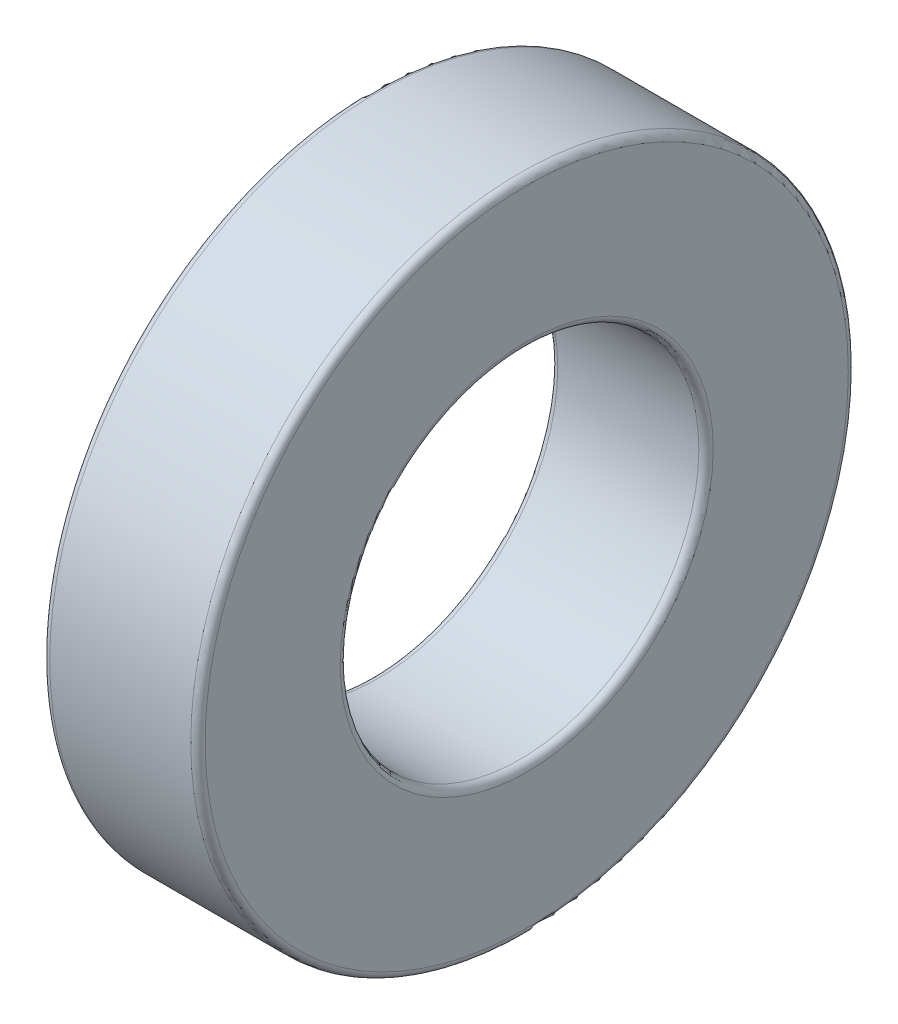
ISO-10303-21;
HEADER;
FILE_DESCRIPTION(('STEP AP214'),'2;1');
FILE_NAME('part.step','',(''),(''),'','','');
FILE_SCHEMA(('AUTOMOTIVE_DESIGN { 1 0 10303 214 1 1 1 1 }'));
ENDSEC;
DATA;
#1=APPLICATION_CONTEXT('core data for automotive mechanical design processes');
#2=APPLICATION_PROTOCOL_DEFINITION('international standard','automotive_design',2000,#1);
#3=PRODUCT_CONTEXT('',#1,'mechanical');
#4=PRODUCT('Part','Part','',(#3));
#5=PRODUCT_RELATED_PRODUCT_CATEGORY('part','',(#4));
#6=PRODUCT_DEFINITION_FORMATION('','',#4);
#7=PRODUCT_DEFINITION_CONTEXT('part definition',#1,'design');
#8=PRODUCT_DEFINITION('design','',#6,#7);
#9=PRODUCT_DEFINITION_SHAPE('','',#8);
#10=(LENGTH_UNIT() NAMED_UNIT(*) SI_UNIT(.MILLI.,.METRE.));
#11=(NAMED_UNIT(*) PLANE_ANGLE_UNIT() SI_UNIT($,.RADIAN.));
#12=(NAMED_UNIT(*) SI_UNIT($,.STERADIAN.) SOLID_ANGLE_UNIT());
#13=UNCERTAINTY_MEASURE_WITH_UNIT(LENGTH_MEASURE(1.E-05),#10,'distance_accuracy_value','');
#14=(GEOMETRIC_REPRESENTATION_CONTEXT(3) GLOBAL_UNCERTAINTY_ASSIGNED_CONTEXT((#13)) GLOBAL_UNIT_ASSIGNED_CONTEXT((#10,
#11,#12)) REPRESENTATION_CONTEXT('',''));
#15=CARTESIAN_POINT('',(0.,0.,0.));
#16=DIRECTION('',(0.,0.,1.));
#17=DIRECTION('',(1.,0.,0.));
#18=AXIS2_PLACEMENT_3D('',#15,#16,#17);
#19=CARTESIAN_POINT('',(0.,26.9,0.));
#20=DIRECTION('',(-1.,0.,0.));
#21=DIRECTION('',(0.,0.,1.));
#22=AXIS2_PLACEMENT_3D('',#19,#20,#21);
#23=PLANE('',#22);
#24=CARTESIAN_POINT('',(0.,0.,0.));
#25=DIRECTION('',(1.,0.,0.));
#26=DIRECTION('',(0.,0.,-1.));
#27=AXIS2_PLACEMENT_3D('',#24,#25,#26);
#28=CIRCLE('',#27,15.6);
#29=CARTESIAN_POINT('',(0.,0.,-15.6));
#30=VERTEX_POINT('',#29);
#31=EDGE_CURVE('E52',#30,#30,#28,.T.);
#32=ORIENTED_EDGE('',*,*,#31,.T.);
#33=EDGE_LOOP('',(#32));
#34=FACE_BOUND('',#33,.T.);
#35=CARTESIAN_POINT('',(0.,0.,0.));
#36=DIRECTION('',(1.,0.,0.));
#37=DIRECTION('',(0.,0.,-1.));
#38=AXIS2_PLACEMENT_3D('',#35,#36,#37);
#39=CIRCLE('',#38,26.9);
#40=CARTESIAN_POINT('',(0.,0.,-26.9));
#41=VERTEX_POINT('',#40);
#42=EDGE_CURVE('E48',#41,#41,#39,.T.);
#43=ORIENTED_EDGE('',*,*,#42,.F.);
#44=EDGE_LOOP('',(#43));
#45=FACE_BOUND('',#44,.T.);
#46=ADVANCED_FACE('F15',(#34,#45),#23,.T.);
#47=CARTESIAN_POINT('',(0.599999999999875,0.,0.));
#48=DIRECTION('',(1.,0.,0.));
#49=DIRECTION('',(0.,0.,-1.));
#50=AXIS2_PLACEMENT_3D('',#47,#48,#49);
#51=TOROIDAL_SURFACE('',#50,15.6,0.599999999999875);
#52=CARTESIAN_POINT('',(0.6,0.,0.));
#53=DIRECTION('',(1.,0.,0.));
#54=DIRECTION('',(0.,0.,-1.));
#55=AXIS2_PLACEMENT_3D('',#52,#53,#54);
#56=CIRCLE('',#55,15.);
#57=CARTESIAN_POINT('',(0.6,0.,-15.));
#58=VERTEX_POINT('',#57);
#59=EDGE_CURVE('E44',#58,#58,#56,.T.);
#60=ORIENTED_EDGE('',*,*,#59,.T.);
#61=EDGE_LOOP('',(#60));
#62=FACE_BOUND('',#61,.T.);
#63=ORIENTED_EDGE('',*,*,#31,.F.);
#64=EDGE_LOOP('',(#63));
#65=FACE_BOUND('',#64,.T.);
#66=ADVANCED_FACE('F59',(#62,#65),#51,.T.);
#67=CARTESIAN_POINT('',(0.599999999999874,0.,0.));
#68=DIRECTION('',(1.,0.,0.));
#69=DIRECTION('',(0.,0.,-1.));
#70=AXIS2_PLACEMENT_3D('',#67,#68,#69);
#71=TOROIDAL_SURFACE('',#70,26.9,0.599999999999875);
#72=ORIENTED_EDGE('',*,*,#42,.T.);
#73=EDGE_LOOP('',(#72));
#74=FACE_BOUND('',#73,.T.);
#75=CARTESIAN_POINT('',(0.6,0.,0.));
#76=DIRECTION('',(1.,0.,0.));
#77=DIRECTION('',(0.,0.,-1.));
#78=AXIS2_PLACEMENT_3D('',#75,#76,#77);
#79=CIRCLE('',#78,27.5);
#80=CARTESIAN_POINT('',(0.6,0.,-27.5));
#81=VERTEX_POINT('',#80);
#82=EDGE_CURVE('E40',#81,#81,#79,.T.);
#83=ORIENTED_EDGE('',*,*,#82,.F.);
#84=EDGE_LOOP('',(#83));
#85=FACE_BOUND('',#84,.T.);
#86=ADVANCED_FACE('F61',(#74,#85),#71,.T.);
#87=CARTESIAN_POINT('',(13.,0.,0.));
#88=DIRECTION('',(1.,0.,0.));
#89=DIRECTION('',(0.,0.,-1.));
#90=AXIS2_PLACEMENT_3D('',#87,#88,#89);
#91=CYLINDRICAL_SURFACE('',#90,15.);
#92=CARTESIAN_POINT('',(12.4,0.,0.));
#93=DIRECTION('',(1.,0.,0.));
#94=DIRECTION('',(0.,0.,-1.));
#95=AXIS2_PLACEMENT_3D('',#92,#93,#94);
#96=CIRCLE('',#95,15.);
#97=CARTESIAN_POINT('',(12.4,0.,-15.));
#98=VERTEX_POINT('',#97);
#99=EDGE_CURVE('E34',#98,#98,#96,.T.);
#100=ORIENTED_EDGE('',*,*,#99,.T.);
#101=EDGE_LOOP('',(#100));
#102=FACE_BOUND('',#101,.T.);
#103=ORIENTED_EDGE('',*,*,#59,.F.);
#104=EDGE_LOOP('',(#103));
#105=FACE_BOUND('',#104,.T.);
#106=ADVANCED_FACE('F69',(#102,#105),#91,.F.);
#107=CARTESIAN_POINT('',(13.,0.,0.));
#108=DIRECTION('',(1.,0.,0.));
#109=DIRECTION('',(0.,0.,-1.));
#110=AXIS2_PLACEMENT_3D('',#107,#108,#109);
#111=CYLINDRICAL_SURFACE('',#110,27.5);
#112=ORIENTED_EDGE('',*,*,#82,.T.);
#113=EDGE_LOOP('',(#112));
#114=FACE_BOUND('',#113,.T.);
#115=CARTESIAN_POINT('',(12.4,0.,0.));
#116=DIRECTION('',(1.,0.,0.));
#117=DIRECTION('',(0.,0.,-1.));
#118=AXIS2_PLACEMENT_3D('',#115,#116,#117);
#119=CIRCLE('',#118,27.5);
#120=CARTESIAN_POINT('',(12.4,0.,-27.5));
#121=VERTEX_POINT('',#120);
#122=EDGE_CURVE('E29',#121,#121,#119,.T.);
#123=ORIENTED_EDGE('',*,*,#122,.F.);
#124=EDGE_LOOP('',(#123));
#125=FACE_BOUND('',#124,.T.);
#126=ADVANCED_FACE('F76',(#114,#125),#111,.T.);
#127=CARTESIAN_POINT('',(12.4000000000002,0.,0.));
#128=DIRECTION('',(1.,0.,0.));
#129=DIRECTION('',(0.,0.,-1.));
#130=AXIS2_PLACEMENT_3D('',#127,#128,#129);
#131=TOROIDAL_SURFACE('',#130,15.5999999999997,0.599999999999752);
#132=CARTESIAN_POINT('',(13.,0.,0.));
#133=DIRECTION('',(1.,0.,0.));
#134=DIRECTION('',(0.,0.,-1.));
#135=AXIS2_PLACEMENT_3D('',#132,#133,#134);
#136=CIRCLE('',#135,15.5999999999997);
#137=CARTESIAN_POINT('',(13.,0.,-15.5999999999997));
#138=VERTEX_POINT('',#137);
#139=EDGE_CURVE('E23',#138,#138,#136,.T.);
#140=ORIENTED_EDGE('',*,*,#139,.T.);
#141=EDGE_LOOP('',(#140));
#142=FACE_BOUND('',#141,.T.);
#143=ORIENTED_EDGE('',*,*,#99,.F.);
#144=EDGE_LOOP('',(#143));
#145=FACE_BOUND('',#144,.T.);
#146=ADVANCED_FACE('F80',(#142,#145),#131,.T.);
#147=CARTESIAN_POINT('',(12.4000000000002,0.,0.));
#148=DIRECTION('',(1.,0.,0.));
#149=DIRECTION('',(0.,0.,-1.));
#150=AXIS2_PLACEMENT_3D('',#147,#148,#149);
#151=TOROIDAL_SURFACE('',#150,26.9,0.599999999999752);
#152=ORIENTED_EDGE('',*,*,#122,.T.);
#153=EDGE_LOOP('',(#152));
#154=FACE_BOUND('',#153,.T.);
#155=CARTESIAN_POINT('',(13.,0.,0.));
#156=DIRECTION('',(1.,0.,0.));
#157=DIRECTION('',(0.,0.,-1.));
#158=AXIS2_PLACEMENT_3D('',#155,#156,#157);
#159=CIRCLE('',#158,26.9);
#160=CARTESIAN_POINT('',(13.,0.,-26.9));
#161=VERTEX_POINT('',#160);
#162=EDGE_CURVE('E10',#161,#161,#159,.T.);
#163=ORIENTED_EDGE('',*,*,#162,.F.);
#164=EDGE_LOOP('',(#163));
#165=FACE_BOUND('',#164,.T.);
#166=ADVANCED_FACE('F83',(#154,#165),#151,.T.);
#167=CARTESIAN_POINT('',(13.,15.6,0.));
#168=DIRECTION('',(1.,0.,0.));
#169=DIRECTION('',(0.,0.,-1.));
#170=AXIS2_PLACEMENT_3D('',#167,#168,#169);
#171=PLANE('',#170);
#172=ORIENTED_EDGE('',*,*,#162,.T.);
#173=EDGE_LOOP('',(#172));
#174=FACE_BOUND('',#173,.T.);
#175=ORIENTED_EDGE('',*,*,#139,.F.);
#176=EDGE_LOOP('',(#175));
#177=FACE_BOUND('',#176,.T.);
#178=ADVANCED_FACE('F17',(#174,#177),#171,.T.);
#179=CLOSED_SHELL('',(#46,#66,#86,#106,#126,#146,#166,#178));
#180=MANIFOLD_SOLID_BREP('B1',#179);
#181=ADVANCED_BREP_SHAPE_REPRESENTATION('',(#18,#180),#14);
#182=SHAPE_DEFINITION_REPRESENTATION(#9,#181);
ENDSEC;
END-ISO-10303-21;
